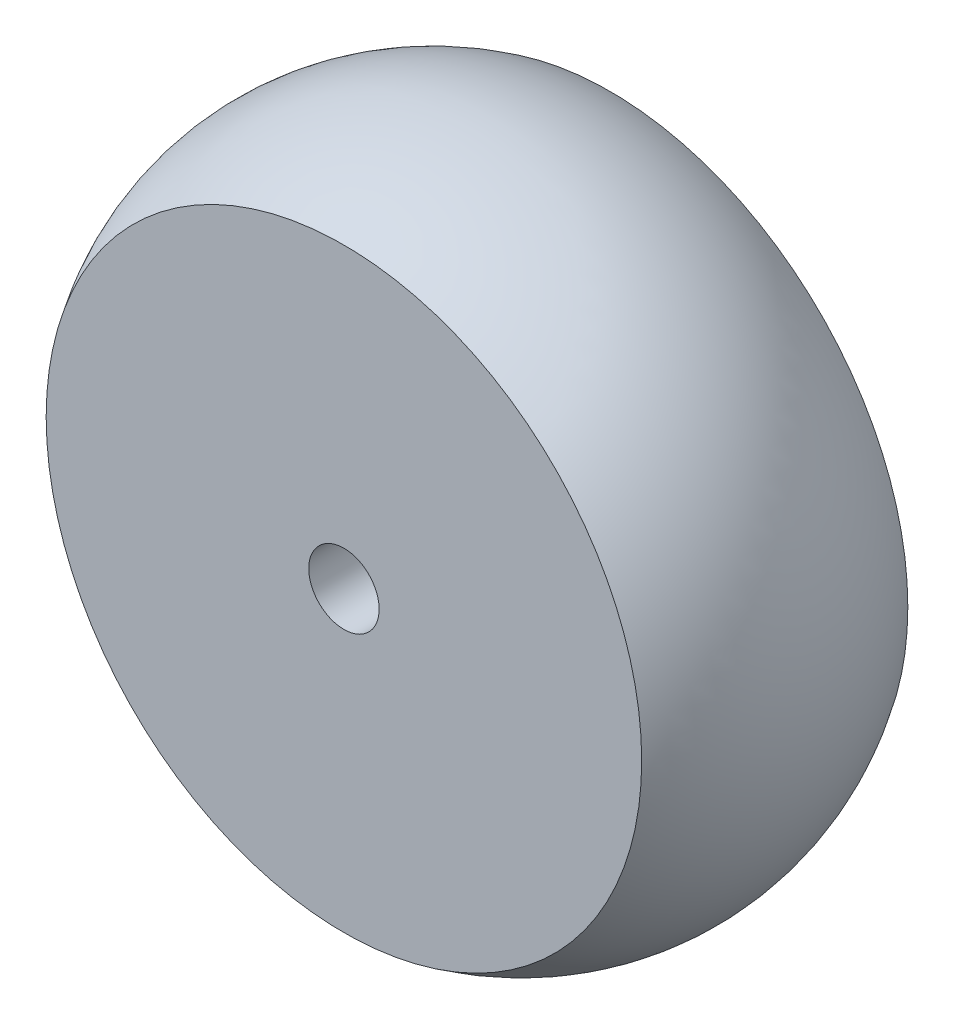
ISO-10303-21;
HEADER;
FILE_DESCRIPTION(('STEP AP214'),'2;1');
FILE_NAME('part.step','',(''),(''),'','','');
FILE_SCHEMA(('AUTOMOTIVE_DESIGN { 1 0 10303 214 1 1 1 1 }'));
ENDSEC;
DATA;
#1=APPLICATION_CONTEXT('core data for automotive mechanical design processes');
#2=APPLICATION_PROTOCOL_DEFINITION('international standard','automotive_design',2000,#1);
#3=PRODUCT_CONTEXT('',#1,'mechanical');
#4=PRODUCT('Part','Part','',(#3));
#5=PRODUCT_RELATED_PRODUCT_CATEGORY('part','',(#4));
#6=PRODUCT_DEFINITION_FORMATION('','',#4);
#7=PRODUCT_DEFINITION_CONTEXT('part definition',#1,'design');
#8=PRODUCT_DEFINITION('design','',#6,#7);
#9=PRODUCT_DEFINITION_SHAPE('','',#8);
#10=(LENGTH_UNIT() NAMED_UNIT(*) SI_UNIT(.MILLI.,.METRE.));
#11=(NAMED_UNIT(*) PLANE_ANGLE_UNIT() SI_UNIT($,.RADIAN.));
#12=(NAMED_UNIT(*) SI_UNIT($,.STERADIAN.) SOLID_ANGLE_UNIT());
#13=UNCERTAINTY_MEASURE_WITH_UNIT(LENGTH_MEASURE(1.E-05),#10,'distance_accuracy_value','');
#14=(GEOMETRIC_REPRESENTATION_CONTEXT(3) GLOBAL_UNCERTAINTY_ASSIGNED_CONTEXT((#13)) GLOBAL_UNIT_ASSIGNED_CONTEXT((#10,
#11,#12)) REPRESENTATION_CONTEXT('',''));
#15=CARTESIAN_POINT('',(0.,0.,0.));
#16=DIRECTION('',(0.,0.,1.));
#17=DIRECTION('',(1.,0.,0.));
#18=AXIS2_PLACEMENT_3D('',#15,#16,#17);
#19=CARTESIAN_POINT('',(0.,0.,0.));
#20=DIRECTION('',(0.,0.,1.));
#21=DIRECTION('',(1.,0.,0.));
#22=AXIS2_PLACEMENT_3D('',#19,#20,#21);
#23=CYLINDRICAL_SURFACE('',#22,1.5875);
#24=CARTESIAN_POINT('',(0.,0.,-12.));
#25=DIRECTION('',(0.,0.,1.));
#26=DIRECTION('',(1.,0.,0.));
#27=AXIS2_PLACEMENT_3D('',#24,#25,#26);
#28=CIRCLE('',#27,1.5875);
#29=CARTESIAN_POINT('',(1.5875,0.,-12.));
#30=VERTEX_POINT('',#29);
#31=EDGE_CURVE('E46',#30,#30,#28,.T.);
#32=ORIENTED_EDGE('',*,*,#31,.F.);
#33=EDGE_LOOP('',(#32));
#34=FACE_BOUND('',#33,.T.);
#35=CARTESIAN_POINT('',(0.,0.,0.));
#36=DIRECTION('',(0.,0.,1.));
#37=DIRECTION('',(1.,0.,0.));
#38=AXIS2_PLACEMENT_3D('',#35,#36,#37);
#39=CIRCLE('',#38,1.5875);
#40=CARTESIAN_POINT('',(1.5875,0.,0.));
#41=VERTEX_POINT('',#40);
#42=EDGE_CURVE('E10',#41,#41,#39,.T.);
#43=ORIENTED_EDGE('',*,*,#42,.T.);
#44=EDGE_LOOP('',(#43));
#45=FACE_BOUND('',#44,.T.);
#46=ADVANCED_FACE('F32',(#34,#45),#23,.F.);
#47=CARTESIAN_POINT('',(0.,1.5875,0.));
#48=DIRECTION('',(0.,0.,-1.));
#49=DIRECTION('',(-1.,0.,0.));
#50=AXIS2_PLACEMENT_3D('',#47,#48,#49);
#51=PLANE('',#50);
#52=ORIENTED_EDGE('',*,*,#42,.F.);
#53=EDGE_LOOP('',(#52));
#54=FACE_BOUND('',#53,.T.);
#55=CARTESIAN_POINT('',(0.,0.,0.));
#56=DIRECTION('',(0.,0.,1.));
#57=DIRECTION('',(1.,0.,0.));
#58=AXIS2_PLACEMENT_3D('',#55,#56,#57);
#59=CIRCLE('',#58,13.4267604803576);
#60=CARTESIAN_POINT('',(13.4267604803576,0.,0.));
#61=VERTEX_POINT('',#60);
#62=EDGE_CURVE('E38',#61,#61,#59,.T.);
#63=ORIENTED_EDGE('',*,*,#62,.T.);
#64=EDGE_LOOP('',(#63));
#65=FACE_BOUND('',#64,.T.);
#66=ADVANCED_FACE('F55',(#54,#65),#51,.F.);
#67=CARTESIAN_POINT('',(0.,0.,-6.));
#68=DIRECTION('',(0.,0.,1.));
#69=DIRECTION('',(1.,0.,0.));
#70=AXIS2_PLACEMENT_3D('',#67,#68,#69);
#71=DEGENERATE_TOROIDAL_SURFACE('',#70,4.46584303040484,10.7841569695952,.T.);
#72=ORIENTED_EDGE('',*,*,#62,.F.);
#73=EDGE_LOOP('',(#72));
#74=FACE_BOUND('',#73,.T.);
#75=CARTESIAN_POINT('',(0.,0.,-12.));
#76=DIRECTION('',(0.,0.,1.));
#77=DIRECTION('',(1.,0.,0.));
#78=AXIS2_PLACEMENT_3D('',#75,#76,#77);
#79=CIRCLE('',#78,13.4267604803576);
#80=CARTESIAN_POINT('',(13.4267604803576,0.,-12.));
#81=VERTEX_POINT('',#80);
#82=EDGE_CURVE('E42',#81,#81,#79,.T.);
#83=ORIENTED_EDGE('',*,*,#82,.T.);
#84=EDGE_LOOP('',(#83));
#85=FACE_BOUND('',#84,.T.);
#86=ADVANCED_FACE('F59',(#74,#85),#71,.T.);
#87=CARTESIAN_POINT('',(0.,1.5875,-12.));
#88=DIRECTION('',(0.,0.,1.));
#89=DIRECTION('',(1.,0.,0.));
#90=AXIS2_PLACEMENT_3D('',#87,#88,#89);
#91=PLANE('',#90);
#92=ORIENTED_EDGE('',*,*,#82,.F.);
#93=EDGE_LOOP('',(#92));
#94=FACE_BOUND('',#93,.T.);
#95=ORIENTED_EDGE('',*,*,#31,.T.);
#96=EDGE_LOOP('',(#95));
#97=FACE_BOUND('',#96,.T.);
#98=ADVANCED_FACE('F52',(#94,#97),#91,.F.);
#99=CLOSED_SHELL('',(#46,#66,#86,#98));
#100=MANIFOLD_SOLID_BREP('B2',#99);
#101=ADVANCED_BREP_SHAPE_REPRESENTATION('',(#18,#100),#14);
#102=SHAPE_DEFINITION_REPRESENTATION(#9,#101);
ENDSEC;
END-ISO-10303-21;
